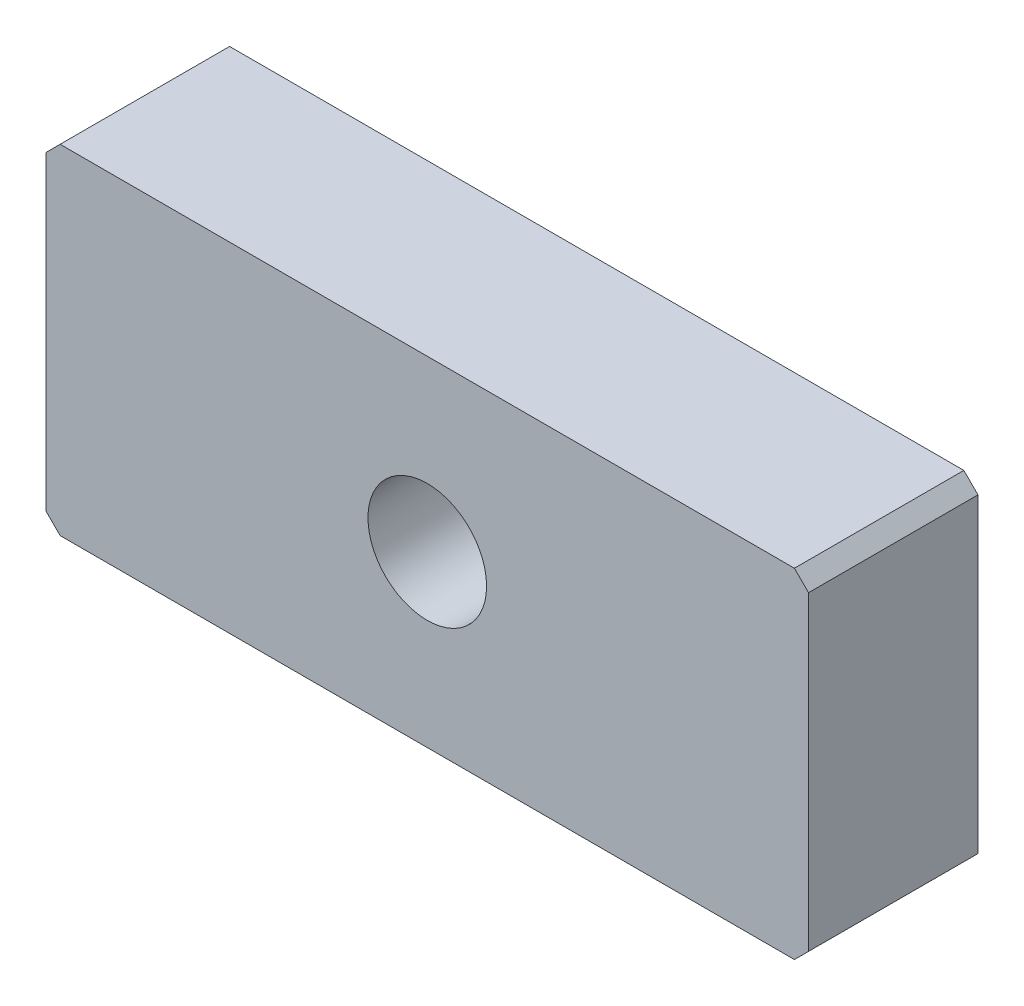
ISO-10303-21;
HEADER;
FILE_DESCRIPTION(('STEP AP214'),'2;1');
FILE_NAME('part.step','',(''),(''),'','','');
FILE_SCHEMA(('AUTOMOTIVE_DESIGN { 1 0 10303 214 1 1 1 1 }'));
ENDSEC;
DATA;
#1=APPLICATION_CONTEXT('core data for automotive mechanical design processes');
#2=APPLICATION_PROTOCOL_DEFINITION('international standard','automotive_design',2000,#1);
#3=PRODUCT_CONTEXT('',#1,'mechanical');
#4=PRODUCT('Part','Part','',(#3));
#5=PRODUCT_RELATED_PRODUCT_CATEGORY('part','',(#4));
#6=PRODUCT_DEFINITION_FORMATION('','',#4);
#7=PRODUCT_DEFINITION_CONTEXT('part definition',#1,'design');
#8=PRODUCT_DEFINITION('design','',#6,#7);
#9=PRODUCT_DEFINITION_SHAPE('','',#8);
#10=(LENGTH_UNIT() NAMED_UNIT(*) SI_UNIT(.MILLI.,.METRE.));
#11=(NAMED_UNIT(*) PLANE_ANGLE_UNIT() SI_UNIT($,.RADIAN.));
#12=(NAMED_UNIT(*) SI_UNIT($,.STERADIAN.) SOLID_ANGLE_UNIT());
#13=UNCERTAINTY_MEASURE_WITH_UNIT(LENGTH_MEASURE(1.E-05),#10,'distance_accuracy_value','');
#14=(GEOMETRIC_REPRESENTATION_CONTEXT(3) GLOBAL_UNCERTAINTY_ASSIGNED_CONTEXT((#13)) GLOBAL_UNIT_ASSIGNED_CONTEXT((#10,
#11,#12)) REPRESENTATION_CONTEXT('',''));
#15=CARTESIAN_POINT('',(0.,0.,0.));
#16=DIRECTION('',(0.,0.,1.));
#17=DIRECTION('',(1.,0.,0.));
#18=AXIS2_PLACEMENT_3D('',#15,#16,#17);
#19=CARTESIAN_POINT('',(0.,12.,6.));
#20=DIRECTION('',(0.,0.,-1.));
#21=DIRECTION('',(-1.,0.,0.));
#22=AXIS2_PLACEMENT_3D('',#19,#20,#21);
#23=PLANE('',#22);
#24=DIRECTION('',(0.,-1.,0.));
#25=VECTOR('',#24,1.);
#26=CARTESIAN_POINT('',(0.,0.,6.));
#27=LINE('',#26,#25);
#28=CARTESIAN_POINT('',(0.,11.5,6.));
#29=VERTEX_POINT('',#28);
#30=CARTESIAN_POINT('',(0.,0.500000000000007,6.));
#31=VERTEX_POINT('',#30);
#32=EDGE_CURVE('E138',#29,#31,#27,.T.);
#33=ORIENTED_EDGE('',*,*,#32,.T.);
#34=DIRECTION('',(-0.707106781186545,0.70710678118655,0.));
#35=VECTOR('',#34,1.);
#36=CARTESIAN_POINT('',(0.500000000000004,0.,6.));
#37=LINE('',#36,#35);
#38=CARTESIAN_POINT('',(0.500000000000004,0.,6.));
#39=VERTEX_POINT('',#38);
#40=EDGE_CURVE('E153',#31,#39,#37,.F.);
#41=ORIENTED_EDGE('',*,*,#40,.T.);
#42=DIRECTION('',(1.,0.,0.));
#43=VECTOR('',#42,1.);
#44=CARTESIAN_POINT('',(0.,0.,6.));
#45=LINE('',#44,#43);
#46=CARTESIAN_POINT('',(26.5,0.,6.));
#47=VERTEX_POINT('',#46);
#48=EDGE_CURVE('E120',#39,#47,#45,.T.);
#49=ORIENTED_EDGE('',*,*,#48,.T.);
#50=DIRECTION('',(-0.70710678118655,-0.707106781186545,0.));
#51=VECTOR('',#50,1.);
#52=CARTESIAN_POINT('',(27.,0.500000000000004,6.));
#53=LINE('',#52,#51);
#54=CARTESIAN_POINT('',(27.,0.500000000000004,6.));
#55=VERTEX_POINT('',#54);
#56=EDGE_CURVE('E148',#47,#55,#53,.F.);
#57=ORIENTED_EDGE('',*,*,#56,.T.);
#58=DIRECTION('',(0.,1.,0.));
#59=VECTOR('',#58,1.);
#60=CARTESIAN_POINT('',(27.,0.,6.));
#61=LINE('',#60,#59);
#62=CARTESIAN_POINT('',(27.,11.5,6.));
#63=VERTEX_POINT('',#62);
#64=EDGE_CURVE('E164',#55,#63,#61,.T.);
#65=ORIENTED_EDGE('',*,*,#64,.T.);
#66=DIRECTION('',(0.707106781186543,-0.707106781186552,0.));
#67=VECTOR('',#66,1.);
#68=CARTESIAN_POINT('',(26.5,12.,6.));
#69=LINE('',#68,#67);
#70=CARTESIAN_POINT('',(26.5,12.,6.));
#71=VERTEX_POINT('',#70);
#72=EDGE_CURVE('E56',#63,#71,#69,.F.);
#73=ORIENTED_EDGE('',*,*,#72,.T.);
#74=DIRECTION('',(-1.,0.,0.));
#75=VECTOR('',#74,1.);
#76=CARTESIAN_POINT('',(0.,12.,6.));
#77=LINE('',#76,#75);
#78=CARTESIAN_POINT('',(0.500000000000004,12.,6.));
#79=VERTEX_POINT('',#78);
#80=EDGE_CURVE('E139',#71,#79,#77,.T.);
#81=ORIENTED_EDGE('',*,*,#80,.T.);
#82=DIRECTION('',(0.70710678118655,0.707106781186545,0.));
#83=VECTOR('',#82,1.);
#84=CARTESIAN_POINT('',(0.,11.5,6.));
#85=LINE('',#84,#83);
#86=EDGE_CURVE('E151',#79,#29,#85,.F.);
#87=ORIENTED_EDGE('',*,*,#86,.T.);
#88=EDGE_LOOP('',(#33,#41,#49,#57,#65,#73,#81,#87));
#89=FACE_BOUND('',#88,.T.);
#90=CARTESIAN_POINT('',(13.5,6.,6.));
#91=DIRECTION('',(0.,0.,1.));
#92=DIRECTION('',(1.,0.,0.));
#93=AXIS2_PLACEMENT_3D('',#90,#91,#92);
#94=CIRCLE('',#93,2.1);
#95=CARTESIAN_POINT('',(15.6,6.,6.));
#96=VERTEX_POINT('',#95);
#97=EDGE_CURVE('E133',#96,#96,#94,.T.);
#98=ORIENTED_EDGE('',*,*,#97,.F.);
#99=EDGE_LOOP('',(#98));
#100=FACE_BOUND('',#99,.T.);
#101=ADVANCED_FACE('F34',(#89,#100),#23,.F.);
#102=CARTESIAN_POINT('',(0.,12.,0.));
#103=DIRECTION('',(0.,0.,-1.));
#104=DIRECTION('',(-1.,0.,0.));
#105=AXIS2_PLACEMENT_3D('',#102,#103,#104);
#106=PLANE('',#105);
#107=DIRECTION('',(1.,0.,0.));
#108=VECTOR('',#107,1.);
#109=CARTESIAN_POINT('',(0.,0.,0.));
#110=LINE('',#109,#108);
#111=CARTESIAN_POINT('',(0.500000000000006,0.,0.));
#112=VERTEX_POINT('',#111);
#113=CARTESIAN_POINT('',(26.5,0.,0.));
#114=VERTEX_POINT('',#113);
#115=EDGE_CURVE('E117',#112,#114,#110,.T.);
#116=ORIENTED_EDGE('',*,*,#115,.F.);
#117=DIRECTION('',(0.707106781186545,-0.70710678118655,0.));
#118=VECTOR('',#117,1.);
#119=CARTESIAN_POINT('',(-5.75,6.25000000000004,0.));
#120=LINE('',#119,#118);
#121=CARTESIAN_POINT('',(0.,0.500000000000007,0.));
#122=VERTEX_POINT('',#121);
#123=EDGE_CURVE('E100',#112,#122,#120,.F.);
#124=ORIENTED_EDGE('',*,*,#123,.T.);
#125=DIRECTION('',(0.,-1.,0.));
#126=VECTOR('',#125,1.);
#127=CARTESIAN_POINT('',(0.,0.,0.));
#128=LINE('',#127,#126);
#129=CARTESIAN_POINT('',(0.,11.5,0.));
#130=VERTEX_POINT('',#129);
#131=EDGE_CURVE('E128',#130,#122,#128,.T.);
#132=ORIENTED_EDGE('',*,*,#131,.F.);
#133=DIRECTION('',(-0.70710678118655,-0.707106781186545,0.));
#134=VECTOR('',#133,1.);
#135=CARTESIAN_POINT('',(0.25,11.75,0.));
#136=LINE('',#135,#134);
#137=CARTESIAN_POINT('',(0.500000000000004,12.,0.));
#138=VERTEX_POINT('',#137);
#139=EDGE_CURVE('E111',#130,#138,#136,.F.);
#140=ORIENTED_EDGE('',*,*,#139,.T.);
#141=DIRECTION('',(-1.,0.,0.));
#142=VECTOR('',#141,1.);
#143=CARTESIAN_POINT('',(0.,12.,0.));
#144=LINE('',#143,#142);
#145=CARTESIAN_POINT('',(26.5,12.,0.));
#146=VERTEX_POINT('',#145);
#147=EDGE_CURVE('E131',#146,#138,#144,.T.);
#148=ORIENTED_EDGE('',*,*,#147,.F.);
#149=DIRECTION('',(-0.707106781186543,0.707106781186552,0.));
#150=VECTOR('',#149,1.);
#151=CARTESIAN_POINT('',(13.2500000000002,25.25,0.));
#152=LINE('',#151,#150);
#153=CARTESIAN_POINT('',(27.,11.5,0.));
#154=VERTEX_POINT('',#153);
#155=EDGE_CURVE('E142',#146,#154,#152,.F.);
#156=ORIENTED_EDGE('',*,*,#155,.T.);
#157=DIRECTION('',(0.,1.,0.));
#158=VECTOR('',#157,1.);
#159=CARTESIAN_POINT('',(27.,0.,0.));
#160=LINE('',#159,#158);
#161=CARTESIAN_POINT('',(27.,0.500000000000004,0.));
#162=VERTEX_POINT('',#161);
#163=EDGE_CURVE('E127',#162,#154,#160,.T.);
#164=ORIENTED_EDGE('',*,*,#163,.F.);
#165=DIRECTION('',(0.70710678118655,0.707106781186545,0.));
#166=VECTOR('',#165,1.);
#167=CARTESIAN_POINT('',(19.2499999999999,-7.25000000000004,0.));
#168=LINE('',#167,#166);
#169=EDGE_CURVE('E121',#162,#114,#168,.F.);
#170=ORIENTED_EDGE('',*,*,#169,.T.);
#171=EDGE_LOOP('',(#116,#124,#132,#140,#148,#156,#164,#170));
#172=FACE_BOUND('',#171,.T.);
#173=CARTESIAN_POINT('',(13.5,6.,0.));
#174=DIRECTION('',(0.,0.,1.));
#175=DIRECTION('',(1.,0.,0.));
#176=AXIS2_PLACEMENT_3D('',#173,#174,#175);
#177=CIRCLE('',#176,2.1);
#178=CARTESIAN_POINT('',(15.6,6.,0.));
#179=VERTEX_POINT('',#178);
#180=EDGE_CURVE('E178',#179,#179,#177,.T.);
#181=ORIENTED_EDGE('',*,*,#180,.T.);
#182=EDGE_LOOP('',(#181));
#183=FACE_BOUND('',#182,.T.);
#184=ADVANCED_FACE('F124',(#172,#183),#106,.T.);
#185=CARTESIAN_POINT('',(0.,0.,6.));
#186=DIRECTION('',(1.,0.,0.));
#187=DIRECTION('',(0.,0.,-1.));
#188=AXIS2_PLACEMENT_3D('',#185,#186,#187);
#189=PLANE('',#188);
#190=ORIENTED_EDGE('',*,*,#131,.T.);
#191=DIRECTION('',(0.,0.,1.));
#192=VECTOR('',#191,1.);
#193=CARTESIAN_POINT('',(0.,0.500000000000007,6.));
#194=LINE('',#193,#192);
#195=EDGE_CURVE('E105',#122,#31,#194,.T.);
#196=ORIENTED_EDGE('',*,*,#195,.T.);
#197=ORIENTED_EDGE('',*,*,#32,.F.);
#198=DIRECTION('',(0.,0.,-1.));
#199=VECTOR('',#198,1.);
#200=CARTESIAN_POINT('',(0.,11.5,6.));
#201=LINE('',#200,#199);
#202=EDGE_CURVE('E110',#29,#130,#201,.T.);
#203=ORIENTED_EDGE('',*,*,#202,.T.);
#204=EDGE_LOOP('',(#190,#196,#197,#203));
#205=FACE_BOUND('',#204,.T.);
#206=ADVANCED_FACE('F192',(#205),#189,.F.);
#207=CARTESIAN_POINT('',(0.,0.,6.));
#208=DIRECTION('',(0.,1.,0.));
#209=DIRECTION('',(0.,0.,1.));
#210=AXIS2_PLACEMENT_3D('',#207,#208,#209);
#211=PLANE('',#210);
#212=ORIENTED_EDGE('',*,*,#48,.F.);
#213=DIRECTION('',(0.,0.,-1.));
#214=VECTOR('',#213,1.);
#215=CARTESIAN_POINT('',(0.500000000000004,0.,6.));
#216=LINE('',#215,#214);
#217=EDGE_CURVE('E104',#39,#112,#216,.T.);
#218=ORIENTED_EDGE('',*,*,#217,.T.);
#219=ORIENTED_EDGE('',*,*,#115,.T.);
#220=DIRECTION('',(0.,0.,1.));
#221=VECTOR('',#220,1.);
#222=CARTESIAN_POINT('',(26.5,0.,6.));
#223=LINE('',#222,#221);
#224=EDGE_CURVE('E122',#114,#47,#223,.T.);
#225=ORIENTED_EDGE('',*,*,#224,.T.);
#226=EDGE_LOOP('',(#212,#218,#219,#225));
#227=FACE_BOUND('',#226,.T.);
#228=ADVANCED_FACE('F116',(#227),#211,.F.);
#229=CARTESIAN_POINT('',(27.,0.,6.));
#230=DIRECTION('',(-1.,0.,0.));
#231=DIRECTION('',(0.,0.,1.));
#232=AXIS2_PLACEMENT_3D('',#229,#230,#231);
#233=PLANE('',#232);
#234=ORIENTED_EDGE('',*,*,#163,.T.);
#235=DIRECTION('',(0.,0.,1.));
#236=VECTOR('',#235,1.);
#237=CARTESIAN_POINT('',(27.,11.5,6.));
#238=LINE('',#237,#236);
#239=EDGE_CURVE('E11',#154,#63,#238,.T.);
#240=ORIENTED_EDGE('',*,*,#239,.T.);
#241=ORIENTED_EDGE('',*,*,#64,.F.);
#242=DIRECTION('',(0.,0.,-1.));
#243=VECTOR('',#242,1.);
#244=CARTESIAN_POINT('',(27.,0.500000000000004,6.));
#245=LINE('',#244,#243);
#246=EDGE_CURVE('E42',#55,#162,#245,.T.);
#247=ORIENTED_EDGE('',*,*,#246,.T.);
#248=EDGE_LOOP('',(#234,#240,#241,#247));
#249=FACE_BOUND('',#248,.T.);
#250=ADVANCED_FACE('F162',(#249),#233,.F.);
#251=CARTESIAN_POINT('',(0.,12.,6.));
#252=DIRECTION('',(0.,-1.,0.));
#253=DIRECTION('',(0.,0.,-1.));
#254=AXIS2_PLACEMENT_3D('',#251,#252,#253);
#255=PLANE('',#254);
#256=ORIENTED_EDGE('',*,*,#147,.T.);
#257=DIRECTION('',(0.,0.,1.));
#258=VECTOR('',#257,1.);
#259=CARTESIAN_POINT('',(0.500000000000004,12.,6.));
#260=LINE('',#259,#258);
#261=EDGE_CURVE('E49',#138,#79,#260,.T.);
#262=ORIENTED_EDGE('',*,*,#261,.T.);
#263=ORIENTED_EDGE('',*,*,#80,.F.);
#264=DIRECTION('',(0.,0.,-1.));
#265=VECTOR('',#264,1.);
#266=CARTESIAN_POINT('',(26.5,12.,6.));
#267=LINE('',#266,#265);
#268=EDGE_CURVE('E155',#71,#146,#267,.T.);
#269=ORIENTED_EDGE('',*,*,#268,.T.);
#270=EDGE_LOOP('',(#256,#262,#263,#269));
#271=FACE_BOUND('',#270,.T.);
#272=ADVANCED_FACE('F171',(#271),#255,.F.);
#273=CARTESIAN_POINT('',(13.5,6.,6.));
#274=DIRECTION('',(0.,0.,-1.));
#275=DIRECTION('',(-1.,0.,0.));
#276=AXIS2_PLACEMENT_3D('',#273,#274,#275);
#277=CYLINDRICAL_SURFACE('',#276,2.1);
#278=ORIENTED_EDGE('',*,*,#97,.T.);
#279=EDGE_LOOP('',(#278));
#280=FACE_BOUND('',#279,.T.);
#281=ORIENTED_EDGE('',*,*,#180,.F.);
#282=EDGE_LOOP('',(#281));
#283=FACE_BOUND('',#282,.T.);
#284=ADVANCED_FACE('F184',(#280,#283),#277,.F.);
#285=CARTESIAN_POINT('',(0.500000000000004,0.,6.));
#286=DIRECTION('',(0.70710678118655,0.707106781186545,0.));
#287=DIRECTION('',(0.,0.,-1.));
#288=AXIS2_PLACEMENT_3D('',#285,#286,#287);
#289=PLANE('',#288);
#290=ORIENTED_EDGE('',*,*,#40,.F.);
#291=ORIENTED_EDGE('',*,*,#195,.F.);
#292=ORIENTED_EDGE('',*,*,#123,.F.);
#293=ORIENTED_EDGE('',*,*,#217,.F.);
#294=EDGE_LOOP('',(#290,#291,#292,#293));
#295=FACE_BOUND('',#294,.T.);
#296=ADVANCED_FACE('F103',(#295),#289,.F.);
#297=CARTESIAN_POINT('',(0.,11.5,6.));
#298=DIRECTION('',(0.707106781186545,-0.70710678118655,0.));
#299=DIRECTION('',(0.,0.,-1.));
#300=AXIS2_PLACEMENT_3D('',#297,#298,#299);
#301=PLANE('',#300);
#302=ORIENTED_EDGE('',*,*,#86,.F.);
#303=ORIENTED_EDGE('',*,*,#261,.F.);
#304=ORIENTED_EDGE('',*,*,#139,.F.);
#305=ORIENTED_EDGE('',*,*,#202,.F.);
#306=EDGE_LOOP('',(#302,#303,#304,#305));
#307=FACE_BOUND('',#306,.T.);
#308=ADVANCED_FACE('F207',(#307),#301,.F.);
#309=CARTESIAN_POINT('',(26.5,12.,6.));
#310=DIRECTION('',(-0.707106781186552,-0.707106781186542,0.));
#311=DIRECTION('',(0.,0.,-1.));
#312=AXIS2_PLACEMENT_3D('',#309,#310,#311);
#313=PLANE('',#312);
#314=ORIENTED_EDGE('',*,*,#72,.F.);
#315=ORIENTED_EDGE('',*,*,#239,.F.);
#316=ORIENTED_EDGE('',*,*,#155,.F.);
#317=ORIENTED_EDGE('',*,*,#268,.F.);
#318=EDGE_LOOP('',(#314,#315,#316,#317));
#319=FACE_BOUND('',#318,.T.);
#320=ADVANCED_FACE('F170',(#319),#313,.F.);
#321=CARTESIAN_POINT('',(27.,0.500000000000004,6.));
#322=DIRECTION('',(-0.707106781186545,0.70710678118655,0.));
#323=DIRECTION('',(0.,0.,-1.));
#324=AXIS2_PLACEMENT_3D('',#321,#322,#323);
#325=PLANE('',#324);
#326=ORIENTED_EDGE('',*,*,#56,.F.);
#327=ORIENTED_EDGE('',*,*,#224,.F.);
#328=ORIENTED_EDGE('',*,*,#169,.F.);
#329=ORIENTED_EDGE('',*,*,#246,.F.);
#330=EDGE_LOOP('',(#326,#327,#328,#329));
#331=FACE_BOUND('',#330,.T.);
#332=ADVANCED_FACE('F36',(#331),#325,.F.);
#333=CLOSED_SHELL('',(#101,#184,#206,#228,#250,#272,#284,#296,#308,#320,#332));
#334=MANIFOLD_SOLID_BREP('B2',#333);
#335=ADVANCED_BREP_SHAPE_REPRESENTATION('',(#18,#334),#14);
#336=SHAPE_DEFINITION_REPRESENTATION(#9,#335);
ENDSEC;
END-ISO-10303-21;
